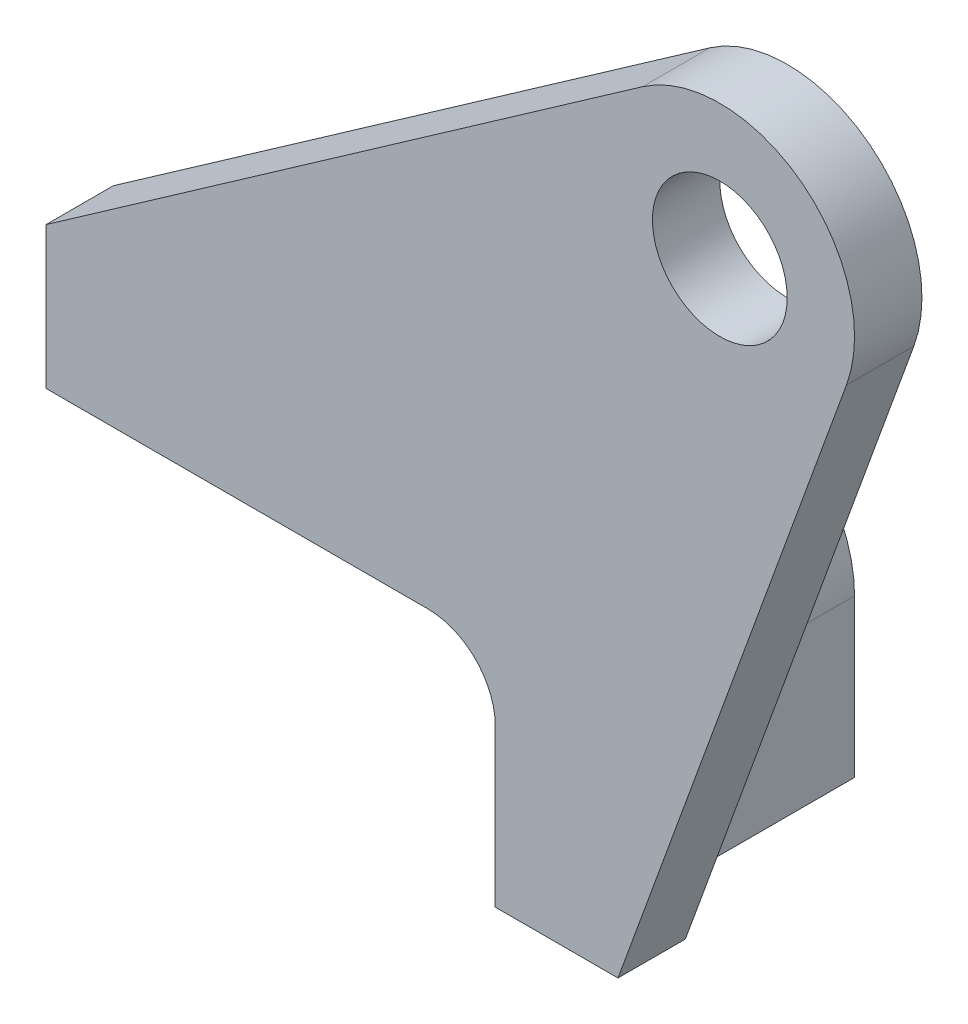
ISO-10303-21;
HEADER;
FILE_DESCRIPTION(('STEP AP214'),'2;1');
FILE_NAME('part.step','',(''),(''),'','','');
FILE_SCHEMA(('AUTOMOTIVE_DESIGN { 1 0 10303 214 1 1 1 1 }'));
ENDSEC;
DATA;
#1=APPLICATION_CONTEXT('core data for automotive mechanical design processes');
#2=APPLICATION_PROTOCOL_DEFINITION('international standard','automotive_design',2000,#1);
#3=PRODUCT_CONTEXT('',#1,'mechanical');
#4=PRODUCT('Part','Part','',(#3));
#5=PRODUCT_RELATED_PRODUCT_CATEGORY('part','',(#4));
#6=PRODUCT_DEFINITION_FORMATION('','',#4);
#7=PRODUCT_DEFINITION_CONTEXT('part definition',#1,'design');
#8=PRODUCT_DEFINITION('design','',#6,#7);
#9=PRODUCT_DEFINITION_SHAPE('','',#8);
#10=(LENGTH_UNIT() NAMED_UNIT(*) SI_UNIT(.MILLI.,.METRE.));
#11=(NAMED_UNIT(*) PLANE_ANGLE_UNIT() SI_UNIT($,.RADIAN.));
#12=(NAMED_UNIT(*) SI_UNIT($,.STERADIAN.) SOLID_ANGLE_UNIT());
#13=UNCERTAINTY_MEASURE_WITH_UNIT(LENGTH_MEASURE(1.E-05),#10,'distance_accuracy_value','');
#14=(GEOMETRIC_REPRESENTATION_CONTEXT(3) GLOBAL_UNCERTAINTY_ASSIGNED_CONTEXT((#13)) GLOBAL_UNIT_ASSIGNED_CONTEXT((#10,
#11,#12)) REPRESENTATION_CONTEXT('',''));
#15=CARTESIAN_POINT('',(0.,0.,0.));
#16=DIRECTION('',(0.,0.,1.));
#17=DIRECTION('',(1.,0.,0.));
#18=AXIS2_PLACEMENT_3D('',#15,#16,#17);
#19=CARTESIAN_POINT('',(-6.,-6.,0.));
#20=DIRECTION('',(0.,0.,-1.));
#21=DIRECTION('',(-1.,0.,0.));
#22=AXIS2_PLACEMENT_3D('',#19,#20,#21);
#23=PLANE('',#22);
#24=CARTESIAN_POINT('',(20.,40.,0.));
#25=DIRECTION('',(0.,0.,1.));
#26=DIRECTION('',(1.,0.,0.));
#27=AXIS2_PLACEMENT_3D('',#24,#25,#26);
#28=CIRCLE('',#27,5.99999999999999);
#29=CARTESIAN_POINT('',(26.,40.,0.));
#30=VERTEX_POINT('',#29);
#31=EDGE_CURVE('E182',#30,#30,#28,.T.);
#32=ORIENTED_EDGE('',*,*,#31,.T.);
#33=EDGE_LOOP('',(#32));
#34=FACE_BOUND('',#33,.T.);
#35=DIRECTION('',(1.,0.,0.));
#36=VECTOR('',#35,1.);
#37=CARTESIAN_POINT('',(0.,-20.,0.));
#38=LINE('',#37,#36);
#39=CARTESIAN_POINT('',(10.,-20.,0.));
#40=VERTEX_POINT('',#39);
#41=CARTESIAN_POINT('',(10.9319192137381,-20.,0.));
#42=VERTEX_POINT('',#41);
#43=EDGE_CURVE('E214',#40,#42,#38,.T.);
#44=ORIENTED_EDGE('',*,*,#43,.F.);
#45=DIRECTION('',(0.,1.,0.));
#46=VECTOR('',#45,1.);
#47=CARTESIAN_POINT('',(10.,-6.00000000000008,0.));
#48=LINE('',#47,#46);
#49=CARTESIAN_POINT('',(10.,-6.00000000000008,0.));
#50=VERTEX_POINT('',#49);
#51=EDGE_CURVE('E240',#40,#50,#48,.T.);
#52=ORIENTED_EDGE('',*,*,#51,.T.);
#53=CARTESIAN_POINT('',(-6.,-6.,0.));
#54=DIRECTION('',(0.,0.,-1.));
#55=DIRECTION('',(-1.,0.,0.));
#56=AXIS2_PLACEMENT_3D('',#53,#54,#55);
#57=CIRCLE('',#56,16.);
#58=CARTESIAN_POINT('',(-6.00000000000006,10.,0.));
#59=VERTEX_POINT('',#58);
#60=EDGE_CURVE('E238',#50,#59,#57,.F.);
#61=ORIENTED_EDGE('',*,*,#60,.T.);
#62=DIRECTION('',(-1.,0.,0.));
#63=VECTOR('',#62,1.);
#64=CARTESIAN_POINT('',(-40.,10.,0.));
#65=LINE('',#64,#63);
#66=CARTESIAN_POINT('',(-40.,10.,0.));
#67=VERTEX_POINT('',#66);
#68=EDGE_CURVE('E145',#59,#67,#65,.T.);
#69=ORIENTED_EDGE('',*,*,#68,.T.);
#70=DIRECTION('',(0.,-1.,0.));
#71=VECTOR('',#70,1.);
#72=CARTESIAN_POINT('',(-40.,12.6368427725553,0.));
#73=LINE('',#72,#71);
#74=CARTESIAN_POINT('',(-40.,12.6368427725553,0.));
#75=VERTEX_POINT('',#74);
#76=EDGE_CURVE('E193',#75,#67,#73,.T.);
#77=ORIENTED_EDGE('',*,*,#76,.F.);
#78=DIRECTION('',(-0.819152044288995,-0.573576436351042,0.));
#79=VECTOR('',#78,1.);
#80=CARTESIAN_POINT('',(13.1170827637875,49.8298245314679,0.));
#81=LINE('',#80,#79);
#82=CARTESIAN_POINT('',(13.1170827637875,49.8298245314679,0.));
#83=VERTEX_POINT('',#82);
#84=EDGE_CURVE('E198',#83,#75,#81,.T.);
#85=ORIENTED_EDGE('',*,*,#84,.F.);
#86=CARTESIAN_POINT('',(20.,40.,0.));
#87=DIRECTION('',(0.,0.,1.));
#88=DIRECTION('',(1.,0.,0.));
#89=AXIS2_PLACEMENT_3D('',#86,#87,#88);
#90=CIRCLE('',#89,12.);
#91=CARTESIAN_POINT('',(31.2763114494309,35.8957582800919,0.));
#92=VERTEX_POINT('',#91);
#93=EDGE_CURVE('E218',#92,#83,#90,.T.);
#94=ORIENTED_EDGE('',*,*,#93,.F.);
#95=DIRECTION('',(0.342020143325679,0.939692620785905,0.));
#96=VECTOR('',#95,1.);
#97=CARTESIAN_POINT('',(10.9319192137381,-20.,0.));
#98=LINE('',#97,#96);
#99=EDGE_CURVE('E216',#42,#92,#98,.T.);
#100=ORIENTED_EDGE('',*,*,#99,.F.);
#101=EDGE_LOOP('',(#44,#52,#61,#69,#77,#85,#94,#100));
#102=FACE_BOUND('',#101,.T.);
#103=ADVANCED_FACE('F34',(#34,#102),#23,.T.);
#104=CARTESIAN_POINT('',(-6.,-6.,6.));
#105=DIRECTION('',(0.,0.,-1.));
#106=DIRECTION('',(-1.,0.,0.));
#107=AXIS2_PLACEMENT_3D('',#104,#105,#106);
#108=PLANE('',#107);
#109=DIRECTION('',(0.,-1.,0.));
#110=VECTOR('',#109,1.);
#111=CARTESIAN_POINT('',(-40.,12.6368427725553,6.));
#112=LINE('',#111,#110);
#113=CARTESIAN_POINT('',(-40.,12.6368427725553,6.));
#114=VERTEX_POINT('',#113);
#115=CARTESIAN_POINT('',(-40.,0.,6.));
#116=VERTEX_POINT('',#115);
#117=EDGE_CURVE('E196',#114,#116,#112,.T.);
#118=ORIENTED_EDGE('',*,*,#117,.T.);
#119=DIRECTION('',(1.,0.,0.));
#120=VECTOR('',#119,1.);
#121=CARTESIAN_POINT('',(-40.,0.,6.));
#122=LINE('',#121,#120);
#123=CARTESIAN_POINT('',(-6.00000000000004,0.,6.));
#124=VERTEX_POINT('',#123);
#125=EDGE_CURVE('E141',#116,#124,#122,.T.);
#126=ORIENTED_EDGE('',*,*,#125,.T.);
#127=CARTESIAN_POINT('',(-6.,-6.,6.));
#128=DIRECTION('',(0.,0.,-1.));
#129=DIRECTION('',(-1.,0.,0.));
#130=AXIS2_PLACEMENT_3D('',#127,#128,#129);
#131=CIRCLE('',#130,6.);
#132=CARTESIAN_POINT('',(0.,-6.00000000000004,6.));
#133=VERTEX_POINT('',#132);
#134=EDGE_CURVE('E200',#124,#133,#131,.T.);
#135=ORIENTED_EDGE('',*,*,#134,.T.);
#136=DIRECTION('',(0.,-1.,0.));
#137=VECTOR('',#136,1.);
#138=CARTESIAN_POINT('',(0.,-6.00000000000004,6.));
#139=LINE('',#138,#137);
#140=CARTESIAN_POINT('',(0.,-20.,6.));
#141=VERTEX_POINT('',#140);
#142=EDGE_CURVE('E202',#133,#141,#139,.T.);
#143=ORIENTED_EDGE('',*,*,#142,.T.);
#144=DIRECTION('',(1.,0.,0.));
#145=VECTOR('',#144,1.);
#146=CARTESIAN_POINT('',(0.,-20.,6.));
#147=LINE('',#146,#145);
#148=CARTESIAN_POINT('',(10.9319192137381,-20.,6.));
#149=VERTEX_POINT('',#148);
#150=EDGE_CURVE('E204',#141,#149,#147,.T.);
#151=ORIENTED_EDGE('',*,*,#150,.T.);
#152=DIRECTION('',(0.342020143325679,0.939692620785905,0.));
#153=VECTOR('',#152,1.);
#154=CARTESIAN_POINT('',(10.9319192137381,-20.,6.));
#155=LINE('',#154,#153);
#156=CARTESIAN_POINT('',(31.2763114494309,35.8957582800919,6.));
#157=VERTEX_POINT('',#156);
#158=EDGE_CURVE('E206',#149,#157,#155,.T.);
#159=ORIENTED_EDGE('',*,*,#158,.T.);
#160=CARTESIAN_POINT('',(20.,40.,6.));
#161=DIRECTION('',(0.,0.,1.));
#162=DIRECTION('',(1.,0.,0.));
#163=AXIS2_PLACEMENT_3D('',#160,#161,#162);
#164=CIRCLE('',#163,12.);
#165=CARTESIAN_POINT('',(13.1170827637875,49.8298245314679,6.));
#166=VERTEX_POINT('',#165);
#167=EDGE_CURVE('E208',#157,#166,#164,.T.);
#168=ORIENTED_EDGE('',*,*,#167,.T.);
#169=DIRECTION('',(-0.819152044288995,-0.573576436351042,0.));
#170=VECTOR('',#169,1.);
#171=CARTESIAN_POINT('',(13.1170827637875,49.8298245314679,6.));
#172=LINE('',#171,#170);
#173=EDGE_CURVE('E210',#166,#114,#172,.T.);
#174=ORIENTED_EDGE('',*,*,#173,.T.);
#175=EDGE_LOOP('',(#118,#126,#135,#143,#151,#159,#168,#174));
#176=FACE_BOUND('',#175,.T.);
#177=CARTESIAN_POINT('',(20.,40.,6.));
#178=DIRECTION('',(0.,0.,1.));
#179=DIRECTION('',(1.,0.,0.));
#180=AXIS2_PLACEMENT_3D('',#177,#178,#179);
#181=CIRCLE('',#180,5.99999999999999);
#182=CARTESIAN_POINT('',(26.,40.,6.));
#183=VERTEX_POINT('',#182);
#184=EDGE_CURVE('E190',#183,#183,#181,.T.);
#185=ORIENTED_EDGE('',*,*,#184,.F.);
#186=EDGE_LOOP('',(#185));
#187=FACE_BOUND('',#186,.T.);
#188=ADVANCED_FACE('F274',(#176,#187),#108,.F.);
#189=CARTESIAN_POINT('',(-40.,12.6368427725553,6.));
#190=DIRECTION('',(1.,0.,0.));
#191=DIRECTION('',(0.,0.,-1.));
#192=AXIS2_PLACEMENT_3D('',#189,#190,#191);
#193=PLANE('',#192);
#194=ORIENTED_EDGE('',*,*,#76,.T.);
#195=CARTESIAN_POINT('',(-40.,10.,-4.));
#196=DIRECTION('',(1.,0.,0.));
#197=DIRECTION('',(0.,0.,-1.));
#198=AXIS2_PLACEMENT_3D('',#195,#196,#197);
#199=CIRCLE('',#198,4.);
#200=CARTESIAN_POINT('',(-40.,6.,-4.));
#201=VERTEX_POINT('',#200);
#202=EDGE_CURVE('E11',#67,#201,#199,.T.);
#203=ORIENTED_EDGE('',*,*,#202,.T.);
#204=DIRECTION('',(0.,0.,1.));
#205=VECTOR('',#204,1.);
#206=CARTESIAN_POINT('',(-40.,6.,-20.));
#207=LINE('',#206,#205);
#208=CARTESIAN_POINT('',(-40.,6.,-20.));
#209=VERTEX_POINT('',#208);
#210=EDGE_CURVE('E160',#209,#201,#207,.T.);
#211=ORIENTED_EDGE('',*,*,#210,.F.);
#212=DIRECTION('',(0.,-1.,0.));
#213=VECTOR('',#212,1.);
#214=CARTESIAN_POINT('',(-40.,0.,-20.));
#215=LINE('',#214,#213);
#216=CARTESIAN_POINT('',(-40.,0.,-20.));
#217=VERTEX_POINT('',#216);
#218=EDGE_CURVE('E153',#209,#217,#215,.T.);
#219=ORIENTED_EDGE('',*,*,#218,.T.);
#220=DIRECTION('',(0.,0.,-1.));
#221=VECTOR('',#220,1.);
#222=CARTESIAN_POINT('',(-40.,0.,6.));
#223=LINE('',#222,#221);
#224=EDGE_CURVE('E136',#116,#217,#223,.T.);
#225=ORIENTED_EDGE('',*,*,#224,.F.);
#226=ORIENTED_EDGE('',*,*,#117,.F.);
#227=DIRECTION('',(0.,0.,-1.));
#228=VECTOR('',#227,1.);
#229=CARTESIAN_POINT('',(-40.,12.6368427725553,6.));
#230=LINE('',#229,#228);
#231=EDGE_CURVE('E212',#114,#75,#230,.T.);
#232=ORIENTED_EDGE('',*,*,#231,.T.);
#233=EDGE_LOOP('',(#194,#203,#211,#219,#225,#226,#232));
#234=FACE_BOUND('',#233,.T.);
#235=ADVANCED_FACE('F159',(#234),#193,.F.);
#236=CARTESIAN_POINT('',(-40.,0.,6.));
#237=DIRECTION('',(0.,1.,0.));
#238=DIRECTION('',(0.,0.,1.));
#239=AXIS2_PLACEMENT_3D('',#236,#237,#238);
#240=PLANE('',#239);
#241=ORIENTED_EDGE('',*,*,#224,.T.);
#242=DIRECTION('',(1.,0.,0.));
#243=VECTOR('',#242,1.);
#244=CARTESIAN_POINT('',(-40.,0.,-20.));
#245=LINE('',#244,#243);
#246=CARTESIAN_POINT('',(-6.00000000000004,0.,-20.));
#247=VERTEX_POINT('',#246);
#248=EDGE_CURVE('E140',#217,#247,#245,.T.);
#249=ORIENTED_EDGE('',*,*,#248,.T.);
#250=DIRECTION('',(0.,0.,-1.));
#251=VECTOR('',#250,1.);
#252=CARTESIAN_POINT('',(-6.00000000000004,0.,6.));
#253=LINE('',#252,#251);
#254=EDGE_CURVE('E146',#124,#247,#253,.T.);
#255=ORIENTED_EDGE('',*,*,#254,.F.);
#256=ORIENTED_EDGE('',*,*,#125,.F.);
#257=EDGE_LOOP('',(#241,#249,#255,#256));
#258=FACE_BOUND('',#257,.T.);
#259=ADVANCED_FACE('F138',(#258),#240,.F.);
#260=CARTESIAN_POINT('',(-6.,-6.,6.));
#261=DIRECTION('',(0.,0.,-1.));
#262=DIRECTION('',(-1.,0.,0.));
#263=AXIS2_PLACEMENT_3D('',#260,#261,#262);
#264=CYLINDRICAL_SURFACE('',#263,6.);
#265=ORIENTED_EDGE('',*,*,#254,.T.);
#266=CARTESIAN_POINT('',(-6.,-6.,-20.));
#267=DIRECTION('',(0.,0.,-1.));
#268=DIRECTION('',(1.,0.,0.));
#269=AXIS2_PLACEMENT_3D('',#266,#267,#268);
#270=CIRCLE('',#269,6.);
#271=CARTESIAN_POINT('',(0.,-6.00000000000004,-20.));
#272=VERTEX_POINT('',#271);
#273=EDGE_CURVE('E157',#247,#272,#270,.T.);
#274=ORIENTED_EDGE('',*,*,#273,.T.);
#275=DIRECTION('',(0.,0.,-1.));
#276=VECTOR('',#275,1.);
#277=CARTESIAN_POINT('',(0.,-6.00000000000004,6.));
#278=LINE('',#277,#276);
#279=EDGE_CURVE('E234',#133,#272,#278,.T.);
#280=ORIENTED_EDGE('',*,*,#279,.F.);
#281=ORIENTED_EDGE('',*,*,#134,.F.);
#282=EDGE_LOOP('',(#265,#274,#280,#281));
#283=FACE_BOUND('',#282,.T.);
#284=ADVANCED_FACE('F287',(#283),#264,.F.);
#285=CARTESIAN_POINT('',(0.,-6.00000000000004,6.));
#286=DIRECTION('',(1.,0.,0.));
#287=DIRECTION('',(0.,1.,0.));
#288=AXIS2_PLACEMENT_3D('',#285,#286,#287);
#289=PLANE('',#288);
#290=ORIENTED_EDGE('',*,*,#279,.T.);
#291=DIRECTION('',(0.,-1.,0.));
#292=VECTOR('',#291,1.);
#293=CARTESIAN_POINT('',(0.,-6.00000000000004,-20.));
#294=LINE('',#293,#292);
#295=CARTESIAN_POINT('',(0.,-20.,-20.));
#296=VERTEX_POINT('',#295);
#297=EDGE_CURVE('E166',#272,#296,#294,.T.);
#298=ORIENTED_EDGE('',*,*,#297,.T.);
#299=DIRECTION('',(0.,0.,-1.));
#300=VECTOR('',#299,1.);
#301=CARTESIAN_POINT('',(0.,-20.,6.));
#302=LINE('',#301,#300);
#303=EDGE_CURVE('E232',#141,#296,#302,.T.);
#304=ORIENTED_EDGE('',*,*,#303,.F.);
#305=ORIENTED_EDGE('',*,*,#142,.F.);
#306=EDGE_LOOP('',(#290,#298,#304,#305));
#307=FACE_BOUND('',#306,.T.);
#308=ADVANCED_FACE('F283',(#307),#289,.F.);
#309=CARTESIAN_POINT('',(0.,-20.,6.));
#310=DIRECTION('',(0.,1.,0.));
#311=DIRECTION('',(-1.,0.,0.));
#312=AXIS2_PLACEMENT_3D('',#309,#310,#311);
#313=PLANE('',#312);
#314=ORIENTED_EDGE('',*,*,#303,.T.);
#315=DIRECTION('',(1.,0.,0.));
#316=VECTOR('',#315,1.);
#317=CARTESIAN_POINT('',(0.,-20.,-20.));
#318=LINE('',#317,#316);
#319=CARTESIAN_POINT('',(6.,-20.,-20.));
#320=VERTEX_POINT('',#319);
#321=EDGE_CURVE('E169',#296,#320,#318,.T.);
#322=ORIENTED_EDGE('',*,*,#321,.T.);
#323=DIRECTION('',(0.,0.,1.));
#324=VECTOR('',#323,1.);
#325=CARTESIAN_POINT('',(6.,-20.,-20.));
#326=LINE('',#325,#324);
#327=CARTESIAN_POINT('',(6.,-20.,-4.));
#328=VERTEX_POINT('',#327);
#329=EDGE_CURVE('E180',#320,#328,#326,.T.);
#330=ORIENTED_EDGE('',*,*,#329,.T.);
#331=CARTESIAN_POINT('',(10.,-20.,-4.));
#332=DIRECTION('',(0.,1.,0.));
#333=DIRECTION('',(-1.,0.,0.));
#334=AXIS2_PLACEMENT_3D('',#331,#332,#333);
#335=CIRCLE('',#334,4.);
#336=EDGE_CURVE('E43',#328,#40,#335,.T.);
#337=ORIENTED_EDGE('',*,*,#336,.T.);
#338=ORIENTED_EDGE('',*,*,#43,.T.);
#339=DIRECTION('',(0.,0.,-1.));
#340=VECTOR('',#339,1.);
#341=CARTESIAN_POINT('',(10.9319192137381,-20.,6.));
#342=LINE('',#341,#340);
#343=EDGE_CURVE('E229',#149,#42,#342,.T.);
#344=ORIENTED_EDGE('',*,*,#343,.F.);
#345=ORIENTED_EDGE('',*,*,#150,.F.);
#346=EDGE_LOOP('',(#314,#322,#330,#337,#338,#344,#345));
#347=FACE_BOUND('',#346,.T.);
#348=ADVANCED_FACE('F266',(#347),#313,.F.);
#349=CARTESIAN_POINT('',(10.9319192137381,-20.,6.));
#350=DIRECTION('',(-0.939692620785904,0.342020143325679,0.));
#351=DIRECTION('',(-0.342020143325679,-0.939692620785905,0.));
#352=AXIS2_PLACEMENT_3D('',#349,#350,#351);
#353=PLANE('',#352);
#354=ORIENTED_EDGE('',*,*,#99,.T.);
#355=DIRECTION('',(0.,0.,-1.));
#356=VECTOR('',#355,1.);
#357=CARTESIAN_POINT('',(31.2763114494309,35.8957582800919,6.));
#358=LINE('',#357,#356);
#359=EDGE_CURVE('E226',#157,#92,#358,.T.);
#360=ORIENTED_EDGE('',*,*,#359,.F.);
#361=ORIENTED_EDGE('',*,*,#158,.F.);
#362=ORIENTED_EDGE('',*,*,#343,.T.);
#363=EDGE_LOOP('',(#354,#360,#361,#362));
#364=FACE_BOUND('',#363,.T.);
#365=ADVANCED_FACE('F270',(#364),#353,.F.);
#366=CARTESIAN_POINT('',(20.,40.,6.));
#367=DIRECTION('',(0.,0.,-1.));
#368=DIRECTION('',(-1.,0.,0.));
#369=AXIS2_PLACEMENT_3D('',#366,#367,#368);
#370=CYLINDRICAL_SURFACE('',#369,12.);
#371=ORIENTED_EDGE('',*,*,#93,.T.);
#372=DIRECTION('',(0.,0.,-1.));
#373=VECTOR('',#372,1.);
#374=CARTESIAN_POINT('',(13.1170827637875,49.8298245314679,6.));
#375=LINE('',#374,#373);
#376=EDGE_CURVE('E223',#166,#83,#375,.T.);
#377=ORIENTED_EDGE('',*,*,#376,.F.);
#378=ORIENTED_EDGE('',*,*,#167,.F.);
#379=ORIENTED_EDGE('',*,*,#359,.T.);
#380=EDGE_LOOP('',(#371,#377,#378,#379));
#381=FACE_BOUND('',#380,.T.);
#382=ADVANCED_FACE('F320',(#381),#370,.T.);
#383=CARTESIAN_POINT('',(13.1170827637875,49.8298245314679,6.));
#384=DIRECTION('',(0.573576436351042,-0.819152044288995,0.));
#385=DIRECTION('',(0.819152044288995,0.573576436351042,0.));
#386=AXIS2_PLACEMENT_3D('',#383,#384,#385);
#387=PLANE('',#386);
#388=ORIENTED_EDGE('',*,*,#84,.T.);
#389=ORIENTED_EDGE('',*,*,#231,.F.);
#390=ORIENTED_EDGE('',*,*,#173,.F.);
#391=ORIENTED_EDGE('',*,*,#376,.T.);
#392=EDGE_LOOP('',(#388,#389,#390,#391));
#393=FACE_BOUND('',#392,.T.);
#394=ADVANCED_FACE('F316',(#393),#387,.F.);
#395=CARTESIAN_POINT('',(20.,40.,6.));
#396=DIRECTION('',(0.,0.,-1.));
#397=DIRECTION('',(-1.,0.,0.));
#398=AXIS2_PLACEMENT_3D('',#395,#396,#397);
#399=CYLINDRICAL_SURFACE('',#398,5.99999999999999);
#400=ORIENTED_EDGE('',*,*,#184,.T.);
#401=EDGE_LOOP('',(#400));
#402=FACE_BOUND('',#401,.T.);
#403=ORIENTED_EDGE('',*,*,#31,.F.);
#404=EDGE_LOOP('',(#403));
#405=FACE_BOUND('',#404,.T.);
#406=ADVANCED_FACE('F319',(#402,#405),#399,.F.);
#407=CARTESIAN_POINT('',(-40.,6.,-20.));
#408=DIRECTION('',(0.,1.,0.));
#409=DIRECTION('',(0.,0.,1.));
#410=AXIS2_PLACEMENT_3D('',#407,#408,#409);
#411=PLANE('',#410);
#412=ORIENTED_EDGE('',*,*,#210,.T.);
#413=DIRECTION('',(-1.,0.,0.));
#414=VECTOR('',#413,1.);
#415=CARTESIAN_POINT('',(-6.00000000000004,6.,-4.));
#416=LINE('',#415,#414);
#417=CARTESIAN_POINT('',(-6.00000000000004,6.,-4.));
#418=VERTEX_POINT('',#417);
#419=EDGE_CURVE('E56',#201,#418,#416,.F.);
#420=ORIENTED_EDGE('',*,*,#419,.T.);
#421=DIRECTION('',(0.,0.,1.));
#422=VECTOR('',#421,1.);
#423=CARTESIAN_POINT('',(-6.00000000000004,6.,-20.));
#424=LINE('',#423,#422);
#425=CARTESIAN_POINT('',(-6.00000000000004,6.,-20.));
#426=VERTEX_POINT('',#425);
#427=EDGE_CURVE('E183',#426,#418,#424,.T.);
#428=ORIENTED_EDGE('',*,*,#427,.F.);
#429=DIRECTION('',(-1.,0.,0.));
#430=VECTOR('',#429,1.);
#431=CARTESIAN_POINT('',(-40.,6.,-20.));
#432=LINE('',#431,#430);
#433=EDGE_CURVE('E178',#426,#209,#432,.T.);
#434=ORIENTED_EDGE('',*,*,#433,.T.);
#435=EDGE_LOOP('',(#412,#420,#428,#434));
#436=FACE_BOUND('',#435,.T.);
#437=ADVANCED_FACE('F305',(#436),#411,.T.);
#438=CARTESIAN_POINT('',(-6.,-6.,-20.));
#439=DIRECTION('',(0.,0.,1.));
#440=DIRECTION('',(1.,0.,0.));
#441=AXIS2_PLACEMENT_3D('',#438,#439,#440);
#442=CYLINDRICAL_SURFACE('',#441,12.);
#443=ORIENTED_EDGE('',*,*,#427,.T.);
#444=CARTESIAN_POINT('',(-6.,-6.,-4.));
#445=DIRECTION('',(0.,0.,-1.));
#446=DIRECTION('',(-1.,0.,0.));
#447=AXIS2_PLACEMENT_3D('',#444,#445,#446);
#448=CIRCLE('',#447,12.);
#449=CARTESIAN_POINT('',(6.,-6.00000000000008,-4.));
#450=VERTEX_POINT('',#449);
#451=EDGE_CURVE('E245',#418,#450,#448,.T.);
#452=ORIENTED_EDGE('',*,*,#451,.T.);
#453=DIRECTION('',(0.,0.,1.));
#454=VECTOR('',#453,1.);
#455=CARTESIAN_POINT('',(6.,-6.00000000000008,-20.));
#456=LINE('',#455,#454);
#457=CARTESIAN_POINT('',(6.,-6.00000000000008,-20.));
#458=VERTEX_POINT('',#457);
#459=EDGE_CURVE('E185',#458,#450,#456,.T.);
#460=ORIENTED_EDGE('',*,*,#459,.F.);
#461=CARTESIAN_POINT('',(-6.,-6.,-20.));
#462=DIRECTION('',(0.,0.,1.));
#463=DIRECTION('',(1.,0.,0.));
#464=AXIS2_PLACEMENT_3D('',#461,#462,#463);
#465=CIRCLE('',#464,12.);
#466=EDGE_CURVE('E175',#458,#426,#465,.T.);
#467=ORIENTED_EDGE('',*,*,#466,.T.);
#468=EDGE_LOOP('',(#443,#452,#460,#467));
#469=FACE_BOUND('',#468,.T.);
#470=ADVANCED_FACE('F295',(#469),#442,.T.);
#471=CARTESIAN_POINT('',(6.,-6.00000000000008,-20.));
#472=DIRECTION('',(1.,0.,0.));
#473=DIRECTION('',(0.,1.,0.));
#474=AXIS2_PLACEMENT_3D('',#471,#472,#473);
#475=PLANE('',#474);
#476=ORIENTED_EDGE('',*,*,#459,.T.);
#477=DIRECTION('',(0.,1.,0.));
#478=VECTOR('',#477,1.);
#479=CARTESIAN_POINT('',(6.,-20.,-4.));
#480=LINE('',#479,#478);
#481=EDGE_CURVE('E243',#450,#328,#480,.F.);
#482=ORIENTED_EDGE('',*,*,#481,.T.);
#483=ORIENTED_EDGE('',*,*,#329,.F.);
#484=DIRECTION('',(0.,1.,0.));
#485=VECTOR('',#484,1.);
#486=CARTESIAN_POINT('',(6.,-6.00000000000008,-20.));
#487=LINE('',#486,#485);
#488=EDGE_CURVE('E172',#320,#458,#487,.T.);
#489=ORIENTED_EDGE('',*,*,#488,.T.);
#490=EDGE_LOOP('',(#476,#482,#483,#489));
#491=FACE_BOUND('',#490,.T.);
#492=ADVANCED_FACE('F297',(#491),#475,.T.);
#493=CARTESIAN_POINT('',(-6.,-6.,-20.));
#494=DIRECTION('',(0.,0.,1.));
#495=DIRECTION('',(1.,0.,0.));
#496=AXIS2_PLACEMENT_3D('',#493,#494,#495);
#497=PLANE('',#496);
#498=ORIENTED_EDGE('',*,*,#218,.F.);
#499=ORIENTED_EDGE('',*,*,#433,.F.);
#500=ORIENTED_EDGE('',*,*,#466,.F.);
#501=ORIENTED_EDGE('',*,*,#488,.F.);
#502=ORIENTED_EDGE('',*,*,#321,.F.);
#503=ORIENTED_EDGE('',*,*,#297,.F.);
#504=ORIENTED_EDGE('',*,*,#273,.F.);
#505=ORIENTED_EDGE('',*,*,#248,.F.);
#506=EDGE_LOOP('',(#498,#499,#500,#501,#502,#503,#504,#505));
#507=FACE_BOUND('',#506,.T.);
#508=ADVANCED_FACE('F151',(#507),#497,.F.);
#509=CARTESIAN_POINT('',(-6.,10.,-4.));
#510=DIRECTION('',(1.,0.,0.));
#511=DIRECTION('',(0.,0.,-1.));
#512=AXIS2_PLACEMENT_3D('',#509,#510,#511);
#513=CYLINDRICAL_SURFACE('',#512,4.);
#514=ORIENTED_EDGE('',*,*,#202,.F.);
#515=ORIENTED_EDGE('',*,*,#68,.F.);
#516=CARTESIAN_POINT('',(-6.00000000000004,10.,-4.));
#517=DIRECTION('',(-1.,0.,0.));
#518=DIRECTION('',(0.,0.,1.));
#519=AXIS2_PLACEMENT_3D('',#516,#517,#518);
#520=CIRCLE('',#519,4.);
#521=EDGE_CURVE('E38',#418,#59,#520,.T.);
#522=ORIENTED_EDGE('',*,*,#521,.F.);
#523=ORIENTED_EDGE('',*,*,#419,.F.);
#524=EDGE_LOOP('',(#514,#515,#522,#523));
#525=FACE_BOUND('',#524,.T.);
#526=ADVANCED_FACE('F36',(#525),#513,.F.);
#527=CARTESIAN_POINT('',(-6.,-6.,-4.));
#528=DIRECTION('',(0.,0.,-1.));
#529=DIRECTION('',(-1.,0.,0.));
#530=AXIS2_PLACEMENT_3D('',#527,#528,#529);
#531=TOROIDAL_SURFACE('',#530,16.,4.);
#532=ORIENTED_EDGE('',*,*,#521,.T.);
#533=ORIENTED_EDGE('',*,*,#60,.F.);
#534=CARTESIAN_POINT('',(10.,-6.0000000000001,-4.));
#535=DIRECTION('',(0.,1.,0.));
#536=DIRECTION('',(0.,0.,1.));
#537=AXIS2_PLACEMENT_3D('',#534,#535,#536);
#538=CIRCLE('',#537,4.);
#539=EDGE_CURVE('E163',#450,#50,#538,.T.);
#540=ORIENTED_EDGE('',*,*,#539,.F.);
#541=ORIENTED_EDGE('',*,*,#451,.F.);
#542=EDGE_LOOP('',(#532,#533,#540,#541));
#543=FACE_BOUND('',#542,.T.);
#544=ADVANCED_FACE('F257',(#543),#531,.F.);
#545=CARTESIAN_POINT('',(10.,-6.,-4.));
#546=DIRECTION('',(0.,-1.,0.));
#547=DIRECTION('',(1.,0.,0.));
#548=AXIS2_PLACEMENT_3D('',#545,#546,#547);
#549=CYLINDRICAL_SURFACE('',#548,4.);
#550=ORIENTED_EDGE('',*,*,#336,.F.);
#551=ORIENTED_EDGE('',*,*,#481,.F.);
#552=ORIENTED_EDGE('',*,*,#539,.T.);
#553=ORIENTED_EDGE('',*,*,#51,.F.);
#554=EDGE_LOOP('',(#550,#551,#552,#553));
#555=FACE_BOUND('',#554,.T.);
#556=ADVANCED_FACE('F254',(#555),#549,.F.);
#557=CLOSED_SHELL('',(#103,#188,#235,#259,#284,#308,#348,#365,#382,#394,#406,#437,#470,#492,
#508,#526,#544,#556));
#558=MANIFOLD_SOLID_BREP('B2',#557);
#559=ADVANCED_BREP_SHAPE_REPRESENTATION('',(#18,#558),#14);
#560=SHAPE_DEFINITION_REPRESENTATION(#9,#559);
ENDSEC;
END-ISO-10303-21;
